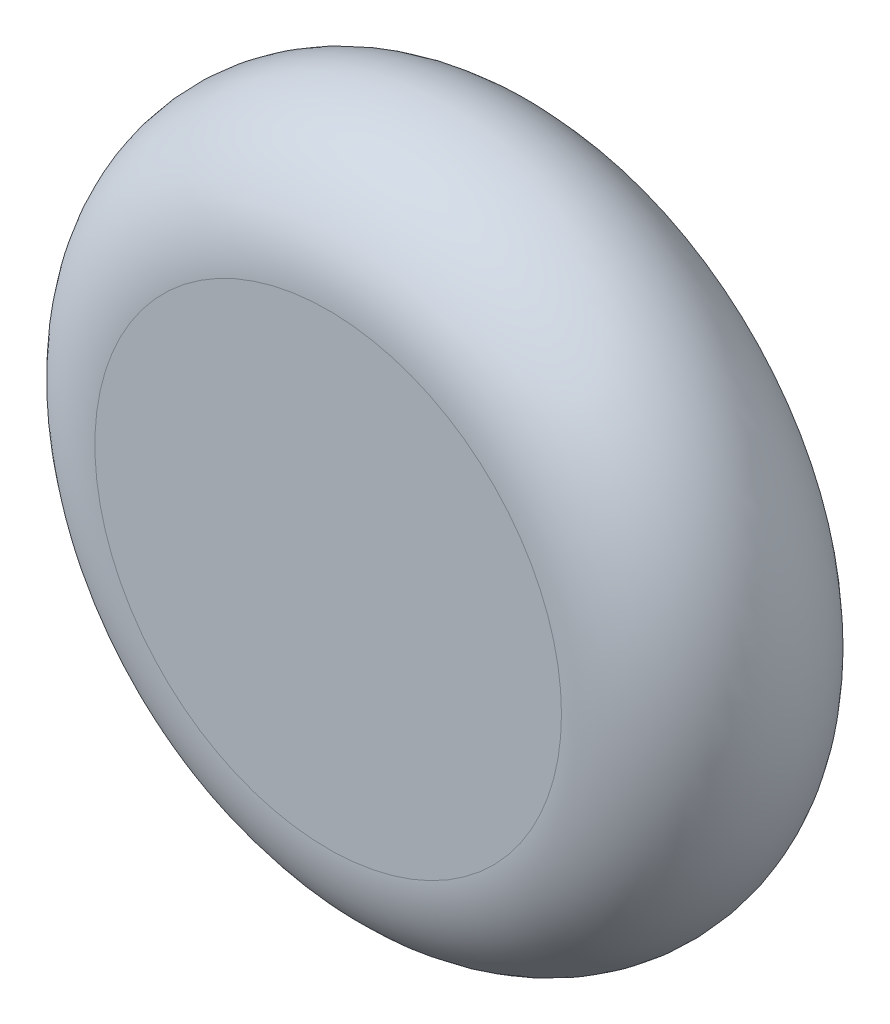
ISO-10303-21;
HEADER;
FILE_DESCRIPTION(('STEP AP214'),'2;1');
FILE_NAME('part.step','',(''),(''),'','','');
FILE_SCHEMA(('AUTOMOTIVE_DESIGN { 1 0 10303 214 1 1 1 1 }'));
ENDSEC;
DATA;
#1=APPLICATION_CONTEXT('core data for automotive mechanical design processes');
#2=APPLICATION_PROTOCOL_DEFINITION('international standard','automotive_design',2000,#1);
#3=PRODUCT_CONTEXT('',#1,'mechanical');
#4=PRODUCT('Part','Part','',(#3));
#5=PRODUCT_RELATED_PRODUCT_CATEGORY('part','',(#4));
#6=PRODUCT_DEFINITION_FORMATION('','',#4);
#7=PRODUCT_DEFINITION_CONTEXT('part definition',#1,'design');
#8=PRODUCT_DEFINITION('design','',#6,#7);
#9=PRODUCT_DEFINITION_SHAPE('','',#8);
#10=(LENGTH_UNIT() NAMED_UNIT(*) SI_UNIT(.MILLI.,.METRE.));
#11=(NAMED_UNIT(*) PLANE_ANGLE_UNIT() SI_UNIT($,.RADIAN.));
#12=(NAMED_UNIT(*) SI_UNIT($,.STERADIAN.) SOLID_ANGLE_UNIT());
#13=UNCERTAINTY_MEASURE_WITH_UNIT(LENGTH_MEASURE(1.E-05),#10,'distance_accuracy_value','');
#14=(GEOMETRIC_REPRESENTATION_CONTEXT(3) GLOBAL_UNCERTAINTY_ASSIGNED_CONTEXT((#13)) GLOBAL_UNIT_ASSIGNED_CONTEXT((#10,
#11,#12)) REPRESENTATION_CONTEXT('',''));
#15=CARTESIAN_POINT('',(0.,0.,0.));
#16=DIRECTION('',(0.,0.,1.));
#17=DIRECTION('',(1.,0.,0.));
#18=AXIS2_PLACEMENT_3D('',#15,#16,#17);
#19=CARTESIAN_POINT('',(0.,0.,-35.));
#20=DIRECTION('',(0.,0.,1.));
#21=DIRECTION('',(1.,0.,0.));
#22=AXIS2_PLACEMENT_3D('',#19,#20,#21);
#23=PLANE('',#22);
#24=CARTESIAN_POINT('',(0.,0.,-35.));
#25=DIRECTION('',(0.,0.,1.));
#26=DIRECTION('',(1.,0.,0.));
#27=AXIS2_PLACEMENT_3D('',#24,#25,#26);
#28=CIRCLE('',#27,7.5);
#29=CARTESIAN_POINT('',(7.5,0.,-35.));
#30=VERTEX_POINT('',#29);
#31=EDGE_CURVE('E10',#30,#30,#28,.F.);
#32=ORIENTED_EDGE('',*,*,#31,.F.);
#33=EDGE_LOOP('',(#32));
#34=FACE_BOUND('',#33,.T.);
#35=CARTESIAN_POINT('',(0.,0.,-35.));
#36=DIRECTION('',(0.,0.,1.));
#37=DIRECTION('',(1.,0.,0.));
#38=AXIS2_PLACEMENT_3D('',#35,#36,#37);
#39=CIRCLE('',#38,118.284271247462);
#40=CARTESIAN_POINT('',(118.284271247462,0.,-35.));
#41=VERTEX_POINT('',#40);
#42=EDGE_CURVE('E40',#41,#41,#39,.T.);
#43=ORIENTED_EDGE('',*,*,#42,.F.);
#44=EDGE_LOOP('',(#43));
#45=FACE_BOUND('',#44,.T.);
#46=ADVANCED_FACE('F34',(#34,#45),#23,.F.);
#47=CARTESIAN_POINT('',(0.,0.,0.));
#48=DIRECTION('',(0.,0.,1.));
#49=DIRECTION('',(1.,0.,0.));
#50=AXIS2_PLACEMENT_3D('',#47,#48,#49);
#51=TOROIDAL_SURFACE('',#50,90.,45.);
#52=CARTESIAN_POINT('',(0.,0.,45.));
#53=DIRECTION('',(0.,0.,1.));
#54=DIRECTION('',(1.,0.,0.));
#55=AXIS2_PLACEMENT_3D('',#52,#53,#54);
#56=CIRCLE('',#55,90.);
#57=CARTESIAN_POINT('',(90.,0.,45.));
#58=VERTEX_POINT('',#57);
#59=EDGE_CURVE('E44',#58,#58,#56,.T.);
#60=ORIENTED_EDGE('',*,*,#59,.F.);
#61=EDGE_LOOP('',(#60));
#62=FACE_BOUND('',#61,.T.);
#63=ORIENTED_EDGE('',*,*,#42,.T.);
#64=EDGE_LOOP('',(#63));
#65=FACE_BOUND('',#64,.T.);
#66=ADVANCED_FACE('F65',(#62,#65),#51,.T.);
#67=CARTESIAN_POINT('',(0.,0.,45.));
#68=DIRECTION('',(0.,0.,-1.));
#69=DIRECTION('',(-1.,0.,0.));
#70=AXIS2_PLACEMENT_3D('',#67,#68,#69);
#71=PLANE('',#70);
#72=ORIENTED_EDGE('',*,*,#59,.T.);
#73=EDGE_LOOP('',(#72));
#74=FACE_BOUND('',#73,.T.);
#75=ADVANCED_FACE('F58',(#74),#71,.F.);
#76=CARTESIAN_POINT('',(0.,0.,-55.));
#77=DIRECTION('',(0.,0.,1.));
#78=DIRECTION('',(1.,0.,0.));
#79=AXIS2_PLACEMENT_3D('',#76,#77,#78);
#80=CYLINDRICAL_SURFACE('',#79,7.5);
#81=CARTESIAN_POINT('',(0.,0.,-55.));
#82=DIRECTION('',(0.,0.,-1.));
#83=DIRECTION('',(-1.,0.,0.));
#84=AXIS2_PLACEMENT_3D('',#81,#82,#83);
#85=CIRCLE('',#84,7.5);
#86=CARTESIAN_POINT('',(-7.5,0.,-55.));
#87=VERTEX_POINT('',#86);
#88=EDGE_CURVE('E48',#87,#87,#85,.T.);
#89=ORIENTED_EDGE('',*,*,#88,.F.);
#90=EDGE_LOOP('',(#89));
#91=FACE_BOUND('',#90,.T.);
#92=ORIENTED_EDGE('',*,*,#31,.T.);
#93=EDGE_LOOP('',(#92));
#94=FACE_BOUND('',#93,.T.);
#95=ADVANCED_FACE('F56',(#91,#94),#80,.T.);
#96=CARTESIAN_POINT('',(0.,0.,-55.));
#97=DIRECTION('',(0.,0.,-1.));
#98=DIRECTION('',(-1.,0.,0.));
#99=AXIS2_PLACEMENT_3D('',#96,#97,#98);
#100=PLANE('',#99);
#101=ORIENTED_EDGE('',*,*,#88,.T.);
#102=EDGE_LOOP('',(#101));
#103=FACE_BOUND('',#102,.T.);
#104=ADVANCED_FACE('F54',(#103),#100,.T.);
#105=CLOSED_SHELL('',(#46,#66,#75,#95,#104));
#106=MANIFOLD_SOLID_BREP('B2',#105);
#107=ADVANCED_BREP_SHAPE_REPRESENTATION('',(#18,#106),#14);
#108=SHAPE_DEFINITION_REPRESENTATION(#9,#107);
ENDSEC;
END-ISO-10303-21;
